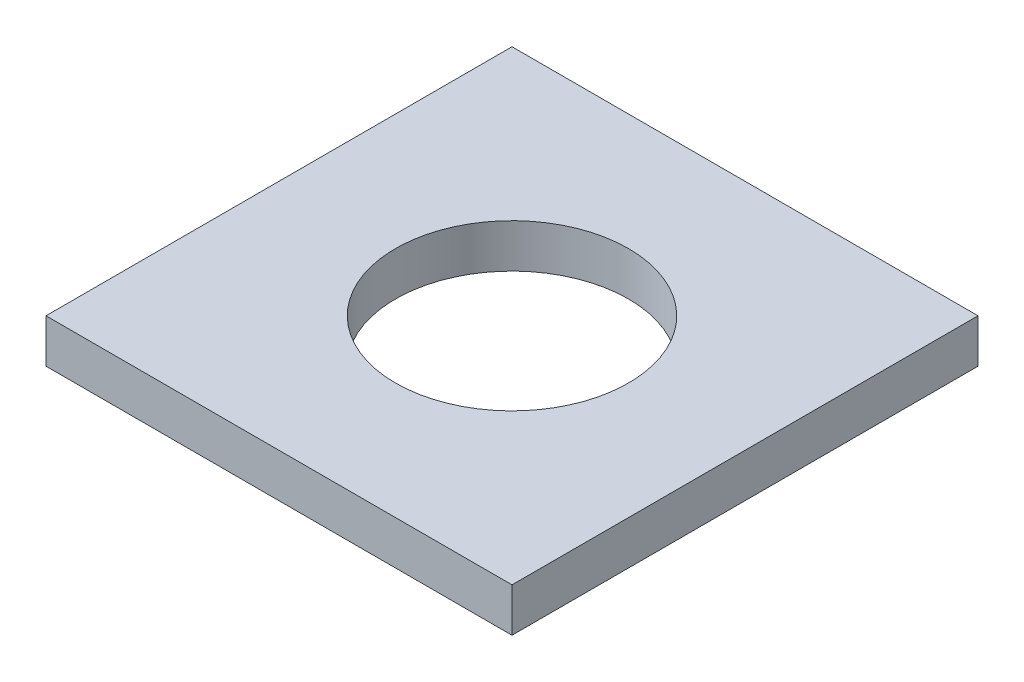
ISO-10303-21;
HEADER;
FILE_DESCRIPTION(('STEP AP214'),'2;1');
FILE_NAME('part.step','',(''),(''),'','','');
FILE_SCHEMA(('AUTOMOTIVE_DESIGN { 1 0 10303 214 1 1 1 1 }'));
ENDSEC;
DATA;
#1=APPLICATION_CONTEXT('core data for automotive mechanical design processes');
#2=APPLICATION_PROTOCOL_DEFINITION('international standard','automotive_design',2000,#1);
#3=PRODUCT_CONTEXT('',#1,'mechanical');
#4=PRODUCT('Part','Part','',(#3));
#5=PRODUCT_RELATED_PRODUCT_CATEGORY('part','',(#4));
#6=PRODUCT_DEFINITION_FORMATION('','',#4);
#7=PRODUCT_DEFINITION_CONTEXT('part definition',#1,'design');
#8=PRODUCT_DEFINITION('design','',#6,#7);
#9=PRODUCT_DEFINITION_SHAPE('','',#8);
#10=(LENGTH_UNIT() NAMED_UNIT(*) SI_UNIT(.MILLI.,.METRE.));
#11=(NAMED_UNIT(*) PLANE_ANGLE_UNIT() SI_UNIT($,.RADIAN.));
#12=(NAMED_UNIT(*) SI_UNIT($,.STERADIAN.) SOLID_ANGLE_UNIT());
#13=UNCERTAINTY_MEASURE_WITH_UNIT(LENGTH_MEASURE(1.E-05),#10,'distance_accuracy_value','');
#14=(GEOMETRIC_REPRESENTATION_CONTEXT(3) GLOBAL_UNCERTAINTY_ASSIGNED_CONTEXT((#13)) GLOBAL_UNIT_ASSIGNED_CONTEXT((#10,
#11,#12)) REPRESENTATION_CONTEXT('',''));
#15=CARTESIAN_POINT('',(0.,0.,0.));
#16=DIRECTION('',(0.,0.,1.));
#17=DIRECTION('',(1.,0.,0.));
#18=AXIS2_PLACEMENT_3D('',#15,#16,#17);
#19=CARTESIAN_POINT('',(25.4,4.7625,-25.4));
#20=DIRECTION('',(-1.,0.,0.));
#21=DIRECTION('',(0.,0.,1.));
#22=AXIS2_PLACEMENT_3D('',#19,#20,#21);
#23=PLANE('',#22);
#24=DIRECTION('',(0.,0.,-1.));
#25=VECTOR('',#24,1.);
#26=CARTESIAN_POINT('',(25.4,0.,-25.4));
#27=LINE('',#26,#25);
#28=CARTESIAN_POINT('',(25.4,0.,25.4));
#29=VERTEX_POINT('',#28);
#30=CARTESIAN_POINT('',(25.4,0.,-25.4));
#31=VERTEX_POINT('',#30);
#32=EDGE_CURVE('E96',#29,#31,#27,.T.);
#33=ORIENTED_EDGE('',*,*,#32,.T.);
#34=DIRECTION('',(0.,-1.,0.));
#35=VECTOR('',#34,1.);
#36=CARTESIAN_POINT('',(25.4,4.7625,-25.4));
#37=LINE('',#36,#35);
#38=CARTESIAN_POINT('',(25.4,4.7625,-25.4));
#39=VERTEX_POINT('',#38);
#40=EDGE_CURVE('E11',#39,#31,#37,.T.);
#41=ORIENTED_EDGE('',*,*,#40,.F.);
#42=DIRECTION('',(0.,0.,-1.));
#43=VECTOR('',#42,1.);
#44=CARTESIAN_POINT('',(25.4,4.7625,-25.4));
#45=LINE('',#44,#43);
#46=CARTESIAN_POINT('',(25.4,4.7625,25.4));
#47=VERTEX_POINT('',#46);
#48=EDGE_CURVE('E84',#47,#39,#45,.T.);
#49=ORIENTED_EDGE('',*,*,#48,.F.);
#50=DIRECTION('',(0.,-1.,0.));
#51=VECTOR('',#50,1.);
#52=CARTESIAN_POINT('',(25.4,4.7625,25.4));
#53=LINE('',#52,#51);
#54=EDGE_CURVE('E92',#47,#29,#53,.T.);
#55=ORIENTED_EDGE('',*,*,#54,.T.);
#56=EDGE_LOOP('',(#33,#41,#49,#55));
#57=FACE_BOUND('',#56,.T.);
#58=ADVANCED_FACE('F33',(#57),#23,.F.);
#59=CARTESIAN_POINT('',(-25.4,4.7625,-25.4));
#60=DIRECTION('',(0.,0.,1.));
#61=DIRECTION('',(1.,0.,0.));
#62=AXIS2_PLACEMENT_3D('',#59,#60,#61);
#63=PLANE('',#62);
#64=DIRECTION('',(-1.,0.,0.));
#65=VECTOR('',#64,1.);
#66=CARTESIAN_POINT('',(-25.4,0.,-25.4));
#67=LINE('',#66,#65);
#68=CARTESIAN_POINT('',(-25.4,0.,-25.4));
#69=VERTEX_POINT('',#68);
#70=EDGE_CURVE('E88',#31,#69,#67,.T.);
#71=ORIENTED_EDGE('',*,*,#70,.T.);
#72=DIRECTION('',(0.,-1.,0.));
#73=VECTOR('',#72,1.);
#74=CARTESIAN_POINT('',(-25.4,4.7625,-25.4));
#75=LINE('',#74,#73);
#76=CARTESIAN_POINT('',(-25.4,4.7625,-25.4));
#77=VERTEX_POINT('',#76);
#78=EDGE_CURVE('E41',#77,#69,#75,.T.);
#79=ORIENTED_EDGE('',*,*,#78,.F.);
#80=DIRECTION('',(-1.,0.,0.));
#81=VECTOR('',#80,1.);
#82=CARTESIAN_POINT('',(-25.4,4.7625,-25.4));
#83=LINE('',#82,#81);
#84=EDGE_CURVE('E79',#39,#77,#83,.T.);
#85=ORIENTED_EDGE('',*,*,#84,.F.);
#86=ORIENTED_EDGE('',*,*,#40,.T.);
#87=EDGE_LOOP('',(#71,#79,#85,#86));
#88=FACE_BOUND('',#87,.T.);
#89=ADVANCED_FACE('F87',(#88),#63,.F.);
#90=CARTESIAN_POINT('',(-25.4,4.7625,-25.4));
#91=DIRECTION('',(1.,0.,0.));
#92=DIRECTION('',(0.,0.,-1.));
#93=AXIS2_PLACEMENT_3D('',#90,#91,#92);
#94=PLANE('',#93);
#95=DIRECTION('',(0.,0.,1.));
#96=VECTOR('',#95,1.);
#97=CARTESIAN_POINT('',(-25.4,0.,-25.4));
#98=LINE('',#97,#96);
#99=CARTESIAN_POINT('',(-25.4,0.,25.4));
#100=VERTEX_POINT('',#99);
#101=EDGE_CURVE('E66',#69,#100,#98,.T.);
#102=ORIENTED_EDGE('',*,*,#101,.T.);
#103=DIRECTION('',(0.,-1.,0.));
#104=VECTOR('',#103,1.);
#105=CARTESIAN_POINT('',(-25.4,4.7625,25.4));
#106=LINE('',#105,#104);
#107=CARTESIAN_POINT('',(-25.4,4.7625,25.4));
#108=VERTEX_POINT('',#107);
#109=EDGE_CURVE('E89',#108,#100,#106,.T.);
#110=ORIENTED_EDGE('',*,*,#109,.F.);
#111=DIRECTION('',(0.,0.,1.));
#112=VECTOR('',#111,1.);
#113=CARTESIAN_POINT('',(-25.4,4.7625,-25.4));
#114=LINE('',#113,#112);
#115=EDGE_CURVE('E82',#77,#108,#114,.T.);
#116=ORIENTED_EDGE('',*,*,#115,.F.);
#117=ORIENTED_EDGE('',*,*,#78,.T.);
#118=EDGE_LOOP('',(#102,#110,#116,#117));
#119=FACE_BOUND('',#118,.T.);
#120=ADVANCED_FACE('F90',(#119),#94,.F.);
#121=CARTESIAN_POINT('',(-25.4,4.7625,25.4));
#122=DIRECTION('',(0.,0.,-1.));
#123=DIRECTION('',(-1.,0.,0.));
#124=AXIS2_PLACEMENT_3D('',#121,#122,#123);
#125=PLANE('',#124);
#126=DIRECTION('',(1.,0.,0.));
#127=VECTOR('',#126,1.);
#128=CARTESIAN_POINT('',(-25.4,0.,25.4));
#129=LINE('',#128,#127);
#130=EDGE_CURVE('E72',#100,#29,#129,.T.);
#131=ORIENTED_EDGE('',*,*,#130,.T.);
#132=ORIENTED_EDGE('',*,*,#54,.F.);
#133=DIRECTION('',(1.,0.,0.));
#134=VECTOR('',#133,1.);
#135=CARTESIAN_POINT('',(-25.4,4.7625,25.4));
#136=LINE('',#135,#134);
#137=EDGE_CURVE('E49',#108,#47,#136,.T.);
#138=ORIENTED_EDGE('',*,*,#137,.F.);
#139=ORIENTED_EDGE('',*,*,#109,.T.);
#140=EDGE_LOOP('',(#131,#132,#138,#139));
#141=FACE_BOUND('',#140,.T.);
#142=ADVANCED_FACE('F104',(#141),#125,.F.);
#143=CARTESIAN_POINT('',(25.4,4.7625,25.4));
#144=DIRECTION('',(0.,1.,0.));
#145=DIRECTION('',(0.,0.,1.));
#146=AXIS2_PLACEMENT_3D('',#143,#144,#145);
#147=PLANE('',#146);
#148=CARTESIAN_POINT('',(0.,4.7625,0.));
#149=DIRECTION('',(0.,1.,0.));
#150=DIRECTION('',(0.,0.,1.));
#151=AXIS2_PLACEMENT_3D('',#148,#149,#150);
#152=CIRCLE('',#151,12.7);
#153=CARTESIAN_POINT('',(0.,4.7625,12.7));
#154=VERTEX_POINT('',#153);
#155=EDGE_CURVE('E112',#154,#154,#152,.T.);
#156=ORIENTED_EDGE('',*,*,#155,.F.);
#157=EDGE_LOOP('',(#156));
#158=FACE_BOUND('',#157,.T.);
#159=ORIENTED_EDGE('',*,*,#48,.T.);
#160=ORIENTED_EDGE('',*,*,#84,.T.);
#161=ORIENTED_EDGE('',*,*,#115,.T.);
#162=ORIENTED_EDGE('',*,*,#137,.T.);
#163=EDGE_LOOP('',(#159,#160,#161,#162));
#164=FACE_BOUND('',#163,.T.);
#165=ADVANCED_FACE('F80',(#158,#164),#147,.T.);
#166=CARTESIAN_POINT('',(25.4,0.,25.4));
#167=DIRECTION('',(0.,1.,0.));
#168=DIRECTION('',(0.,0.,1.));
#169=AXIS2_PLACEMENT_3D('',#166,#167,#168);
#170=PLANE('',#169);
#171=CARTESIAN_POINT('',(0.,0.,0.));
#172=DIRECTION('',(0.,1.,0.));
#173=DIRECTION('',(0.,0.,1.));
#174=AXIS2_PLACEMENT_3D('',#171,#172,#173);
#175=CIRCLE('',#174,12.7);
#176=CARTESIAN_POINT('',(0.,0.,12.7));
#177=VERTEX_POINT('',#176);
#178=EDGE_CURVE('E99',#177,#177,#175,.F.);
#179=ORIENTED_EDGE('',*,*,#178,.F.);
#180=EDGE_LOOP('',(#179));
#181=FACE_BOUND('',#180,.T.);
#182=ORIENTED_EDGE('',*,*,#32,.F.);
#183=ORIENTED_EDGE('',*,*,#130,.F.);
#184=ORIENTED_EDGE('',*,*,#101,.F.);
#185=ORIENTED_EDGE('',*,*,#70,.F.);
#186=EDGE_LOOP('',(#182,#183,#184,#185));
#187=FACE_BOUND('',#186,.T.);
#188=ADVANCED_FACE('F107',(#181,#187),#170,.F.);
#189=CARTESIAN_POINT('',(0.,-0.00100000000000013,0.));
#190=DIRECTION('',(0.,1.,0.));
#191=DIRECTION('',(0.,0.,1.));
#192=AXIS2_PLACEMENT_3D('',#189,#190,#191);
#193=CYLINDRICAL_SURFACE('',#192,12.7);
#194=ORIENTED_EDGE('',*,*,#155,.T.);
#195=EDGE_LOOP('',(#194));
#196=FACE_BOUND('',#195,.T.);
#197=ORIENTED_EDGE('',*,*,#178,.T.);
#198=EDGE_LOOP('',(#197));
#199=FACE_BOUND('',#198,.T.);
#200=ADVANCED_FACE('F116',(#196,#199),#193,.F.);
#201=CLOSED_SHELL('',(#58,#89,#120,#142,#165,#188,#200));
#202=MANIFOLD_SOLID_BREP('B2',#201);
#203=ADVANCED_BREP_SHAPE_REPRESENTATION('',(#18,#202),#14);
#204=SHAPE_DEFINITION_REPRESENTATION(#9,#203);
ENDSEC;
END-ISO-10303-21;
